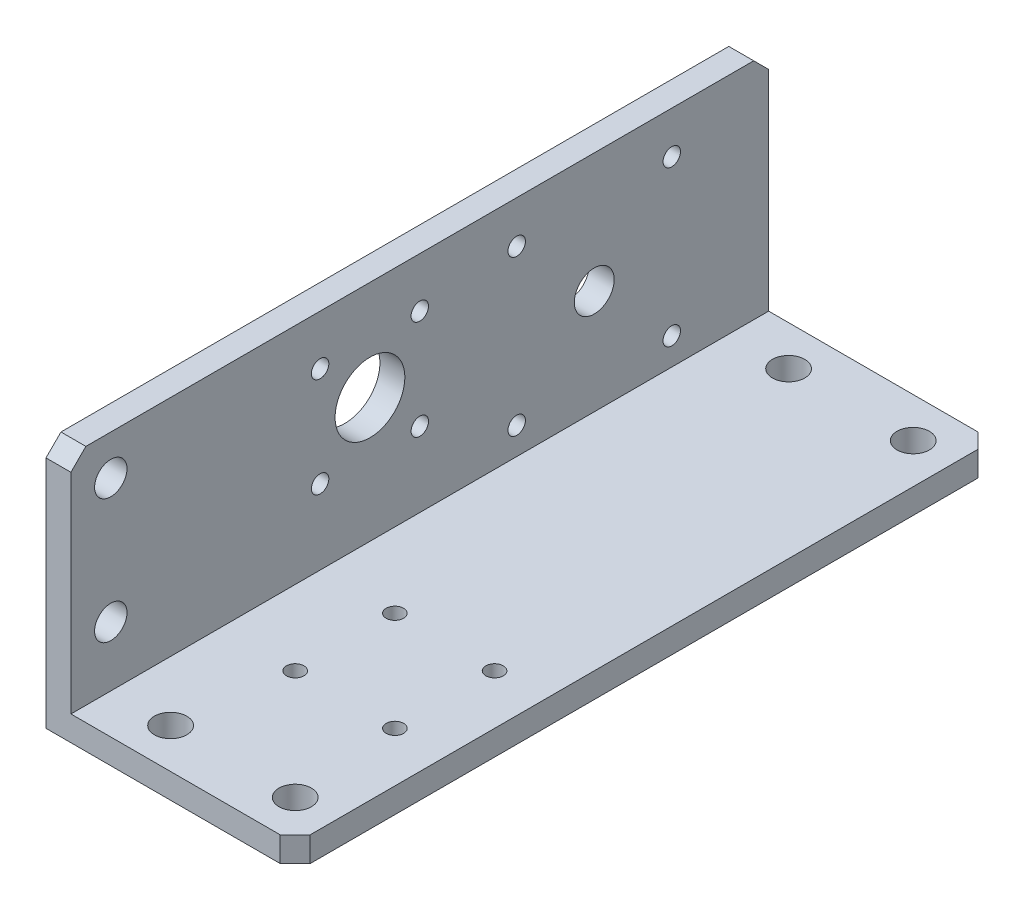
ISO-10303-21;
HEADER;
FILE_DESCRIPTION(('STEP AP214'),'2;1');
FILE_NAME('part.step','',(''),(''),'','','');
FILE_SCHEMA(('AUTOMOTIVE_DESIGN { 1 0 10303 214 1 1 1 1 }'));
ENDSEC;
DATA;
#1=APPLICATION_CONTEXT('core data for automotive mechanical design processes');
#2=APPLICATION_PROTOCOL_DEFINITION('international standard','automotive_design',2000,#1);
#3=PRODUCT_CONTEXT('',#1,'mechanical');
#4=PRODUCT('Part','Part','',(#3));
#5=PRODUCT_RELATED_PRODUCT_CATEGORY('part','',(#4));
#6=PRODUCT_DEFINITION_FORMATION('','',#4);
#7=PRODUCT_DEFINITION_CONTEXT('part definition',#1,'design');
#8=PRODUCT_DEFINITION('design','',#6,#7);
#9=PRODUCT_DEFINITION_SHAPE('','',#8);
#10=(LENGTH_UNIT() NAMED_UNIT(*) SI_UNIT(.MILLI.,.METRE.));
#11=(NAMED_UNIT(*) PLANE_ANGLE_UNIT() SI_UNIT($,.RADIAN.));
#12=(NAMED_UNIT(*) SI_UNIT($,.STERADIAN.) SOLID_ANGLE_UNIT());
#13=UNCERTAINTY_MEASURE_WITH_UNIT(LENGTH_MEASURE(1.E-05),#10,'distance_accuracy_value','');
#14=(GEOMETRIC_REPRESENTATION_CONTEXT(3) GLOBAL_UNCERTAINTY_ASSIGNED_CONTEXT((#13)) GLOBAL_UNIT_ASSIGNED_CONTEXT((#10,
#11,#12)) REPRESENTATION_CONTEXT('',''));
#15=CARTESIAN_POINT('',(0.,0.,0.));
#16=DIRECTION('',(0.,0.,1.));
#17=DIRECTION('',(1.,0.,0.));
#18=AXIS2_PLACEMENT_3D('',#15,#16,#17);
#19=CARTESIAN_POINT('',(50.,0.,140.));
#20=DIRECTION('',(0.,1.,0.));
#21=DIRECTION('',(-1.,0.,0.));
#22=AXIS2_PLACEMENT_3D('',#19,#20,#21);
#23=PLANE('',#22);
#24=CARTESIAN_POINT('',(40.0000000000001,0.,90.0000000000017));
#25=DIRECTION('',(0.,-1.,0.));
#26=DIRECTION('',(1.,0.,0.));
#27=AXIS2_PLACEMENT_3D('',#24,#25,#26);
#28=CIRCLE('',#27,1.74999999999955);
#29=CARTESIAN_POINT('',(41.7499999999996,0.,90.0000000000017));
#30=VERTEX_POINT('',#29);
#31=EDGE_CURVE('E287',#30,#30,#28,.T.);
#32=ORIENTED_EDGE('',*,*,#31,.F.);
#33=EDGE_LOOP('',(#32));
#34=FACE_BOUND('',#33,.T.);
#35=CARTESIAN_POINT('',(39.9999999999999,0.,110.000000000002));
#36=DIRECTION('',(0.,-1.,0.));
#37=DIRECTION('',(1.,0.,0.));
#38=AXIS2_PLACEMENT_3D('',#35,#36,#37);
#39=CIRCLE('',#38,1.74999999999956);
#40=CARTESIAN_POINT('',(41.7499999999995,0.,110.000000000002));
#41=VERTEX_POINT('',#40);
#42=EDGE_CURVE('E281',#41,#41,#39,.T.);
#43=ORIENTED_EDGE('',*,*,#42,.F.);
#44=EDGE_LOOP('',(#43));
#45=FACE_BOUND('',#44,.T.);
#46=CARTESIAN_POINT('',(19.9999999999999,0.,110.000000000002));
#47=DIRECTION('',(0.,-1.,0.));
#48=DIRECTION('',(1.,0.,0.));
#49=AXIS2_PLACEMENT_3D('',#46,#47,#48);
#50=CIRCLE('',#49,1.74999999999956);
#51=CARTESIAN_POINT('',(21.7499999999995,0.,110.000000000002));
#52=VERTEX_POINT('',#51);
#53=EDGE_CURVE('E275',#52,#52,#50,.T.);
#54=ORIENTED_EDGE('',*,*,#53,.F.);
#55=EDGE_LOOP('',(#54));
#56=FACE_BOUND('',#55,.T.);
#57=CARTESIAN_POINT('',(20.0000000000001,0.,90.0000000000015));
#58=DIRECTION('',(0.,-1.,0.));
#59=DIRECTION('',(1.,0.,0.));
#60=AXIS2_PLACEMENT_3D('',#57,#58,#59);
#61=CIRCLE('',#60,1.74999999999955);
#62=CARTESIAN_POINT('',(21.7499999999996,0.,90.0000000000015));
#63=VERTEX_POINT('',#62);
#64=EDGE_CURVE('E269',#63,#63,#61,.T.);
#65=ORIENTED_EDGE('',*,*,#64,.F.);
#66=EDGE_LOOP('',(#65));
#67=FACE_BOUND('',#66,.T.);
#68=CARTESIAN_POINT('',(17.,0.,8.00000000000001));
#69=DIRECTION('',(0.,-1.,0.));
#70=DIRECTION('',(0.,0.,-1.));
#71=AXIS2_PLACEMENT_3D('',#68,#69,#70);
#72=CIRCLE('',#71,3.24999999999999);
#73=CARTESIAN_POINT('',(17.,0.,4.75000000000002));
#74=VERTEX_POINT('',#73);
#75=EDGE_CURVE('E167',#74,#74,#72,.T.);
#76=ORIENTED_EDGE('',*,*,#75,.F.);
#77=EDGE_LOOP('',(#76));
#78=FACE_BOUND('',#77,.T.);
#79=CARTESIAN_POINT('',(42.,0.,8.00000000000001));
#80=DIRECTION('',(0.,-1.,0.));
#81=DIRECTION('',(0.,0.,-1.));
#82=AXIS2_PLACEMENT_3D('',#79,#80,#81);
#83=CIRCLE('',#82,3.24999999999999);
#84=CARTESIAN_POINT('',(42.,0.,4.75000000000002));
#85=VERTEX_POINT('',#84);
#86=EDGE_CURVE('E166',#85,#85,#83,.T.);
#87=ORIENTED_EDGE('',*,*,#86,.F.);
#88=EDGE_LOOP('',(#87));
#89=FACE_BOUND('',#88,.T.);
#90=CARTESIAN_POINT('',(17.,0.,132.));
#91=DIRECTION('',(0.,-1.,0.));
#92=DIRECTION('',(0.,0.,-1.));
#93=AXIS2_PLACEMENT_3D('',#90,#91,#92);
#94=CIRCLE('',#93,3.24999999999999);
#95=CARTESIAN_POINT('',(17.,0.,128.75));
#96=VERTEX_POINT('',#95);
#97=EDGE_CURVE('E214',#96,#96,#94,.T.);
#98=ORIENTED_EDGE('',*,*,#97,.F.);
#99=EDGE_LOOP('',(#98));
#100=FACE_BOUND('',#99,.T.);
#101=CARTESIAN_POINT('',(42.,0.,132.));
#102=DIRECTION('',(0.,-1.,0.));
#103=DIRECTION('',(0.,0.,-1.));
#104=AXIS2_PLACEMENT_3D('',#101,#102,#103);
#105=CIRCLE('',#104,3.24999999999999);
#106=CARTESIAN_POINT('',(42.,0.,128.75));
#107=VERTEX_POINT('',#106);
#108=EDGE_CURVE('E208',#107,#107,#105,.T.);
#109=ORIENTED_EDGE('',*,*,#108,.F.);
#110=EDGE_LOOP('',(#109));
#111=FACE_BOUND('',#110,.T.);
#112=DIRECTION('',(1.,0.,0.));
#113=VECTOR('',#112,1.);
#114=CARTESIAN_POINT('',(50.,0.,0.));
#115=LINE('',#114,#113);
#116=CARTESIAN_POINT('',(0.,0.,0.));
#117=VERTEX_POINT('',#116);
#118=CARTESIAN_POINT('',(47.,0.,0.));
#119=VERTEX_POINT('',#118);
#120=EDGE_CURVE('E142',#117,#119,#115,.T.);
#121=ORIENTED_EDGE('',*,*,#120,.T.);
#122=DIRECTION('',(0.707106781186552,0.,0.707106781186543));
#123=VECTOR('',#122,1.);
#124=CARTESIAN_POINT('',(50.,0.,3.));
#125=LINE('',#124,#123);
#126=CARTESIAN_POINT('',(50.,0.,3.00000000000004));
#127=VERTEX_POINT('',#126);
#128=EDGE_CURVE('E182',#119,#127,#125,.T.);
#129=ORIENTED_EDGE('',*,*,#128,.T.);
#130=DIRECTION('',(0.,0.,-1.));
#131=VECTOR('',#130,1.);
#132=CARTESIAN_POINT('',(50.,0.,140.));
#133=LINE('',#132,#131);
#134=CARTESIAN_POINT('',(50.,0.,137.));
#135=VERTEX_POINT('',#134);
#136=EDGE_CURVE('E159',#135,#127,#133,.T.);
#137=ORIENTED_EDGE('',*,*,#136,.F.);
#138=DIRECTION('',(0.707106781186548,0.,-0.707106781186548));
#139=VECTOR('',#138,1.);
#140=CARTESIAN_POINT('',(47.,0.,140.));
#141=LINE('',#140,#139);
#142=CARTESIAN_POINT('',(47.,0.,140.));
#143=VERTEX_POINT('',#142);
#144=EDGE_CURVE('E180',#135,#143,#141,.F.);
#145=ORIENTED_EDGE('',*,*,#144,.T.);
#146=DIRECTION('',(1.,0.,0.));
#147=VECTOR('',#146,1.);
#148=CARTESIAN_POINT('',(50.,0.,140.));
#149=LINE('',#148,#147);
#150=CARTESIAN_POINT('',(0.,0.,140.));
#151=VERTEX_POINT('',#150);
#152=EDGE_CURVE('E122',#151,#143,#149,.T.);
#153=ORIENTED_EDGE('',*,*,#152,.F.);
#154=DIRECTION('',(0.,0.,-1.));
#155=VECTOR('',#154,1.);
#156=CARTESIAN_POINT('',(0.,0.,140.));
#157=LINE('',#156,#155);
#158=EDGE_CURVE('E138',#151,#117,#157,.T.);
#159=ORIENTED_EDGE('',*,*,#158,.T.);
#160=EDGE_LOOP('',(#121,#129,#137,#145,#153,#159));
#161=FACE_BOUND('',#160,.T.);
#162=ADVANCED_FACE('F36',(#34,#45,#56,#67,#78,#89,#100,#111,#161),#23,.F.);
#163=CARTESIAN_POINT('',(50.,5.,140.));
#164=DIRECTION('',(-1.,0.,0.));
#165=DIRECTION('',(0.,0.,1.));
#166=AXIS2_PLACEMENT_3D('',#163,#164,#165);
#167=PLANE('',#166);
#168=ORIENTED_EDGE('',*,*,#136,.T.);
#169=DIRECTION('',(0.,1.,0.));
#170=VECTOR('',#169,1.);
#171=CARTESIAN_POINT('',(50.,5.,3.));
#172=LINE('',#171,#170);
#173=CARTESIAN_POINT('',(50.,5.,3.00000000000004));
#174=VERTEX_POINT('',#173);
#175=EDGE_CURVE('E169',#127,#174,#172,.T.);
#176=ORIENTED_EDGE('',*,*,#175,.T.);
#177=DIRECTION('',(0.,0.,-1.));
#178=VECTOR('',#177,1.);
#179=CARTESIAN_POINT('',(50.,5.,140.));
#180=LINE('',#179,#178);
#181=CARTESIAN_POINT('',(50.,5.,137.));
#182=VERTEX_POINT('',#181);
#183=EDGE_CURVE('E132',#182,#174,#180,.T.);
#184=ORIENTED_EDGE('',*,*,#183,.F.);
#185=DIRECTION('',(0.,-1.,0.));
#186=VECTOR('',#185,1.);
#187=CARTESIAN_POINT('',(50.,5.,137.));
#188=LINE('',#187,#186);
#189=EDGE_CURVE('E162',#182,#135,#188,.T.);
#190=ORIENTED_EDGE('',*,*,#189,.T.);
#191=EDGE_LOOP('',(#168,#176,#184,#190));
#192=FACE_BOUND('',#191,.T.);
#193=ADVANCED_FACE('F368',(#192),#167,.F.);
#194=CARTESIAN_POINT('',(5.00000000000001,5.,140.));
#195=DIRECTION('',(0.,-1.,0.));
#196=DIRECTION('',(1.,0.,0.));
#197=AXIS2_PLACEMENT_3D('',#194,#195,#196);
#198=PLANE('',#197);
#199=CARTESIAN_POINT('',(40.0000000000001,5.,90.0000000000017));
#200=DIRECTION('',(0.,-1.,0.));
#201=DIRECTION('',(1.,0.,0.));
#202=AXIS2_PLACEMENT_3D('',#199,#200,#201);
#203=CIRCLE('',#202,1.74999999999955);
#204=CARTESIAN_POINT('',(41.7499999999997,5.,90.0000000000017));
#205=VERTEX_POINT('',#204);
#206=EDGE_CURVE('E284',#205,#205,#203,.F.);
#207=ORIENTED_EDGE('',*,*,#206,.F.);
#208=EDGE_LOOP('',(#207));
#209=FACE_BOUND('',#208,.T.);
#210=CARTESIAN_POINT('',(39.9999999999999,5.,110.000000000002));
#211=DIRECTION('',(0.,-1.,0.));
#212=DIRECTION('',(1.,0.,0.));
#213=AXIS2_PLACEMENT_3D('',#210,#211,#212);
#214=CIRCLE('',#213,1.74999999999956);
#215=CARTESIAN_POINT('',(41.7499999999995,5.,110.000000000002));
#216=VERTEX_POINT('',#215);
#217=EDGE_CURVE('E278',#216,#216,#214,.F.);
#218=ORIENTED_EDGE('',*,*,#217,.F.);
#219=EDGE_LOOP('',(#218));
#220=FACE_BOUND('',#219,.T.);
#221=CARTESIAN_POINT('',(19.9999999999999,5.,110.000000000002));
#222=DIRECTION('',(0.,-1.,0.));
#223=DIRECTION('',(1.,0.,0.));
#224=AXIS2_PLACEMENT_3D('',#221,#222,#223);
#225=CIRCLE('',#224,1.74999999999956);
#226=CARTESIAN_POINT('',(21.7499999999995,5.,110.000000000002));
#227=VERTEX_POINT('',#226);
#228=EDGE_CURVE('E272',#227,#227,#225,.F.);
#229=ORIENTED_EDGE('',*,*,#228,.F.);
#230=EDGE_LOOP('',(#229));
#231=FACE_BOUND('',#230,.T.);
#232=CARTESIAN_POINT('',(20.0000000000001,5.,90.0000000000015));
#233=DIRECTION('',(0.,-1.,0.));
#234=DIRECTION('',(1.,0.,0.));
#235=AXIS2_PLACEMENT_3D('',#232,#233,#234);
#236=CIRCLE('',#235,1.74999999999955);
#237=CARTESIAN_POINT('',(21.7499999999996,5.,90.0000000000015));
#238=VERTEX_POINT('',#237);
#239=EDGE_CURVE('E266',#238,#238,#236,.F.);
#240=ORIENTED_EDGE('',*,*,#239,.F.);
#241=EDGE_LOOP('',(#240));
#242=FACE_BOUND('',#241,.T.);
#243=CARTESIAN_POINT('',(17.,5.,8.00000000000001));
#244=DIRECTION('',(0.,-1.,0.));
#245=DIRECTION('',(1.,0.,0.));
#246=AXIS2_PLACEMENT_3D('',#243,#244,#245);
#247=CIRCLE('',#246,3.24999999999999);
#248=CARTESIAN_POINT('',(20.25,5.,8.00000000000001));
#249=VERTEX_POINT('',#248);
#250=EDGE_CURVE('E163',#249,#249,#247,.T.);
#251=ORIENTED_EDGE('',*,*,#250,.T.);
#252=EDGE_LOOP('',(#251));
#253=FACE_BOUND('',#252,.T.);
#254=CARTESIAN_POINT('',(42.,5.,8.00000000000001));
#255=DIRECTION('',(0.,-1.,0.));
#256=DIRECTION('',(1.,0.,0.));
#257=AXIS2_PLACEMENT_3D('',#254,#255,#256);
#258=CIRCLE('',#257,3.24999999999999);
#259=CARTESIAN_POINT('',(45.25,5.,8.00000000000001));
#260=VERTEX_POINT('',#259);
#261=EDGE_CURVE('E229',#260,#260,#258,.T.);
#262=ORIENTED_EDGE('',*,*,#261,.T.);
#263=EDGE_LOOP('',(#262));
#264=FACE_BOUND('',#263,.T.);
#265=CARTESIAN_POINT('',(17.,5.,132.));
#266=DIRECTION('',(0.,-1.,0.));
#267=DIRECTION('',(1.,0.,0.));
#268=AXIS2_PLACEMENT_3D('',#265,#266,#267);
#269=CIRCLE('',#268,3.24999999999999);
#270=CARTESIAN_POINT('',(20.25,5.,132.));
#271=VERTEX_POINT('',#270);
#272=EDGE_CURVE('E211',#271,#271,#269,.T.);
#273=ORIENTED_EDGE('',*,*,#272,.T.);
#274=EDGE_LOOP('',(#273));
#275=FACE_BOUND('',#274,.T.);
#276=CARTESIAN_POINT('',(42.,5.,132.));
#277=DIRECTION('',(0.,-1.,0.));
#278=DIRECTION('',(1.,0.,0.));
#279=AXIS2_PLACEMENT_3D('',#276,#277,#278);
#280=CIRCLE('',#279,3.24999999999999);
#281=CARTESIAN_POINT('',(45.25,5.,132.));
#282=VERTEX_POINT('',#281);
#283=EDGE_CURVE('E145',#282,#282,#280,.T.);
#284=ORIENTED_EDGE('',*,*,#283,.T.);
#285=EDGE_LOOP('',(#284));
#286=FACE_BOUND('',#285,.T.);
#287=ORIENTED_EDGE('',*,*,#183,.T.);
#288=DIRECTION('',(-0.707106781186552,0.,-0.707106781186543));
#289=VECTOR('',#288,1.);
#290=CARTESIAN_POINT('',(50.,5.,3.));
#291=LINE('',#290,#289);
#292=CARTESIAN_POINT('',(46.9999999999999,5.,0.));
#293=VERTEX_POINT('',#292);
#294=EDGE_CURVE('E174',#174,#293,#291,.T.);
#295=ORIENTED_EDGE('',*,*,#294,.T.);
#296=DIRECTION('',(-1.,0.,0.));
#297=VECTOR('',#296,1.);
#298=CARTESIAN_POINT('',(5.00000000000001,5.,0.));
#299=LINE('',#298,#297);
#300=CARTESIAN_POINT('',(5.00000000000001,5.,0.));
#301=VERTEX_POINT('',#300);
#302=EDGE_CURVE('E129',#293,#301,#299,.T.);
#303=ORIENTED_EDGE('',*,*,#302,.T.);
#304=DIRECTION('',(0.,0.,-1.));
#305=VECTOR('',#304,1.);
#306=CARTESIAN_POINT('',(5.00000000000001,5.,140.));
#307=LINE('',#306,#305);
#308=CARTESIAN_POINT('',(5.00000000000001,5.,140.));
#309=VERTEX_POINT('',#308);
#310=EDGE_CURVE('E125',#309,#301,#307,.T.);
#311=ORIENTED_EDGE('',*,*,#310,.F.);
#312=DIRECTION('',(-1.,0.,0.));
#313=VECTOR('',#312,1.);
#314=CARTESIAN_POINT('',(5.00000000000001,5.,140.));
#315=LINE('',#314,#313);
#316=CARTESIAN_POINT('',(47.,5.,140.));
#317=VERTEX_POINT('',#316);
#318=EDGE_CURVE('E115',#317,#309,#315,.T.);
#319=ORIENTED_EDGE('',*,*,#318,.F.);
#320=DIRECTION('',(-0.707106781186548,0.,0.707106781186548));
#321=VECTOR('',#320,1.);
#322=CARTESIAN_POINT('',(47.,5.,140.));
#323=LINE('',#322,#321);
#324=EDGE_CURVE('E172',#317,#182,#323,.F.);
#325=ORIENTED_EDGE('',*,*,#324,.T.);
#326=EDGE_LOOP('',(#287,#295,#303,#311,#319,#325));
#327=FACE_BOUND('',#326,.T.);
#328=ADVANCED_FACE('F127',(#209,#220,#231,#242,#253,#264,#275,#286,#327),#198,.F.);
#329=CARTESIAN_POINT('',(5.,50.,140.));
#330=DIRECTION('',(-1.,0.,0.));
#331=DIRECTION('',(0.,-1.,0.));
#332=AXIS2_PLACEMENT_3D('',#329,#330,#331);
#333=PLANE('',#332);
#334=CARTESIAN_POINT('',(5.,41.556349186104,19.4436508138959));
#335=DIRECTION('',(-1.,0.,0.));
#336=DIRECTION('',(0.,-1.,0.));
#337=AXIS2_PLACEMENT_3D('',#334,#335,#336);
#338=CIRCLE('',#337,1.75);
#339=CARTESIAN_POINT('',(5.,39.806349186104,19.4436508138959));
#340=VERTEX_POINT('',#339);
#341=EDGE_CURVE('E314',#340,#340,#338,.F.);
#342=ORIENTED_EDGE('',*,*,#341,.F.);
#343=EDGE_LOOP('',(#342));
#344=FACE_BOUND('',#343,.T.);
#345=CARTESIAN_POINT('',(5.,10.4436508138959,19.443650813896));
#346=DIRECTION('',(-1.,0.,0.));
#347=DIRECTION('',(0.,-1.,0.));
#348=AXIS2_PLACEMENT_3D('',#345,#346,#347);
#349=CIRCLE('',#348,1.75);
#350=CARTESIAN_POINT('',(5.,8.69365081389592,19.443650813896));
#351=VERTEX_POINT('',#350);
#352=EDGE_CURVE('E308',#351,#351,#349,.F.);
#353=ORIENTED_EDGE('',*,*,#352,.F.);
#354=EDGE_LOOP('',(#353));
#355=FACE_BOUND('',#354,.T.);
#356=CARTESIAN_POINT('',(5.,10.443650813896,50.5563491861041));
#357=DIRECTION('',(-1.,0.,0.));
#358=DIRECTION('',(0.,-1.,0.));
#359=AXIS2_PLACEMENT_3D('',#356,#357,#358);
#360=CIRCLE('',#359,1.75);
#361=CARTESIAN_POINT('',(5.,8.69365081389599,50.5563491861041));
#362=VERTEX_POINT('',#361);
#363=EDGE_CURVE('E302',#362,#362,#360,.F.);
#364=ORIENTED_EDGE('',*,*,#363,.F.);
#365=EDGE_LOOP('',(#364));
#366=FACE_BOUND('',#365,.T.);
#367=CARTESIAN_POINT('',(5.,26.,35.));
#368=DIRECTION('',(-1.,0.,0.));
#369=DIRECTION('',(0.,-1.,0.));
#370=AXIS2_PLACEMENT_3D('',#367,#368,#369);
#371=CIRCLE('',#370,4.);
#372=CARTESIAN_POINT('',(5.00000000000001,22.,35.));
#373=VERTEX_POINT('',#372);
#374=EDGE_CURVE('E296',#373,#373,#371,.F.);
#375=ORIENTED_EDGE('',*,*,#374,.F.);
#376=EDGE_LOOP('',(#375));
#377=FACE_BOUND('',#376,.T.);
#378=CARTESIAN_POINT('',(5.,41.5563491861041,50.556349186104));
#379=DIRECTION('',(-1.,0.,0.));
#380=DIRECTION('',(0.,-1.,0.));
#381=AXIS2_PLACEMENT_3D('',#378,#379,#380);
#382=CIRCLE('',#381,1.75);
#383=CARTESIAN_POINT('',(5.,39.8063491861041,50.556349186104));
#384=VERTEX_POINT('',#383);
#385=EDGE_CURVE('E290',#384,#384,#382,.F.);
#386=ORIENTED_EDGE('',*,*,#385,.F.);
#387=EDGE_LOOP('',(#386));
#388=FACE_BOUND('',#387,.T.);
#389=CARTESIAN_POINT('',(5.,20.,70.));
#390=DIRECTION('',(-1.,0.,0.));
#391=DIRECTION('',(0.,-1.,0.));
#392=AXIS2_PLACEMENT_3D('',#389,#390,#391);
#393=CIRCLE('',#392,1.75);
#394=CARTESIAN_POINT('',(5.,18.25,70.));
#395=VERTEX_POINT('',#394);
#396=EDGE_CURVE('E260',#395,#395,#393,.F.);
#397=ORIENTED_EDGE('',*,*,#396,.F.);
#398=EDGE_LOOP('',(#397));
#399=FACE_BOUND('',#398,.T.);
#400=CARTESIAN_POINT('',(5.,20.,90.));
#401=DIRECTION('',(-1.,0.,0.));
#402=DIRECTION('',(0.,-1.,0.));
#403=AXIS2_PLACEMENT_3D('',#400,#401,#402);
#404=CIRCLE('',#403,1.75);
#405=CARTESIAN_POINT('',(5.,18.25,90.));
#406=VERTEX_POINT('',#405);
#407=EDGE_CURVE('E254',#406,#406,#404,.F.);
#408=ORIENTED_EDGE('',*,*,#407,.F.);
#409=EDGE_LOOP('',(#408));
#410=FACE_BOUND('',#409,.T.);
#411=CARTESIAN_POINT('',(5.,40.,90.));
#412=DIRECTION('',(-1.,0.,0.));
#413=DIRECTION('',(0.,-1.,0.));
#414=AXIS2_PLACEMENT_3D('',#411,#412,#413);
#415=CIRCLE('',#414,1.75);
#416=CARTESIAN_POINT('',(5.,38.25,90.));
#417=VERTEX_POINT('',#416);
#418=EDGE_CURVE('E248',#417,#417,#415,.F.);
#419=ORIENTED_EDGE('',*,*,#418,.F.);
#420=EDGE_LOOP('',(#419));
#421=FACE_BOUND('',#420,.T.);
#422=CARTESIAN_POINT('',(5.,30.,80.));
#423=DIRECTION('',(-1.,0.,0.));
#424=DIRECTION('',(0.,-1.,0.));
#425=AXIS2_PLACEMENT_3D('',#422,#423,#424);
#426=CIRCLE('',#425,7.);
#427=CARTESIAN_POINT('',(5.00000000000001,23.,80.));
#428=VERTEX_POINT('',#427);
#429=EDGE_CURVE('E242',#428,#428,#426,.F.);
#430=ORIENTED_EDGE('',*,*,#429,.F.);
#431=EDGE_LOOP('',(#430));
#432=FACE_BOUND('',#431,.T.);
#433=CARTESIAN_POINT('',(5.,40.,70.));
#434=DIRECTION('',(-1.,0.,0.));
#435=DIRECTION('',(0.,-1.,0.));
#436=AXIS2_PLACEMENT_3D('',#433,#434,#435);
#437=CIRCLE('',#436,1.75);
#438=CARTESIAN_POINT('',(5.,38.25,70.));
#439=VERTEX_POINT('',#438);
#440=EDGE_CURVE('E236',#439,#439,#437,.F.);
#441=ORIENTED_EDGE('',*,*,#440,.F.);
#442=EDGE_LOOP('',(#441));
#443=FACE_BOUND('',#442,.T.);
#444=CARTESIAN_POINT('',(5.,42.,132.));
#445=DIRECTION('',(-1.,0.,0.));
#446=DIRECTION('',(0.,0.,1.));
#447=AXIS2_PLACEMENT_3D('',#444,#445,#446);
#448=CIRCLE('',#447,3.25);
#449=CARTESIAN_POINT('',(5.,42.,135.25));
#450=VERTEX_POINT('',#449);
#451=EDGE_CURVE('E223',#450,#450,#448,.T.);
#452=ORIENTED_EDGE('',*,*,#451,.T.);
#453=EDGE_LOOP('',(#452));
#454=FACE_BOUND('',#453,.T.);
#455=CARTESIAN_POINT('',(5.,17.,132.));
#456=DIRECTION('',(-1.,0.,0.));
#457=DIRECTION('',(0.,0.,1.));
#458=AXIS2_PLACEMENT_3D('',#455,#456,#457);
#459=CIRCLE('',#458,3.25);
#460=CARTESIAN_POINT('',(5.,17.,135.25));
#461=VERTEX_POINT('',#460);
#462=EDGE_CURVE('E217',#461,#461,#459,.T.);
#463=ORIENTED_EDGE('',*,*,#462,.T.);
#464=EDGE_LOOP('',(#463));
#465=FACE_BOUND('',#464,.T.);
#466=DIRECTION('',(0.,1.,0.));
#467=VECTOR('',#466,1.);
#468=CARTESIAN_POINT('',(5.,50.,0.));
#469=LINE('',#468,#467);
#470=CARTESIAN_POINT('',(5.,47.,0.));
#471=VERTEX_POINT('',#470);
#472=EDGE_CURVE('E147',#301,#471,#469,.T.);
#473=ORIENTED_EDGE('',*,*,#472,.T.);
#474=DIRECTION('',(0.,0.707106781186552,0.707106781186543));
#475=VECTOR('',#474,1.);
#476=CARTESIAN_POINT('',(5.,50.,3.));
#477=LINE('',#476,#475);
#478=CARTESIAN_POINT('',(5.,50.,3.00000000000004));
#479=VERTEX_POINT('',#478);
#480=EDGE_CURVE('E193',#471,#479,#477,.T.);
#481=ORIENTED_EDGE('',*,*,#480,.T.);
#482=DIRECTION('',(0.,0.,-1.));
#483=VECTOR('',#482,1.);
#484=CARTESIAN_POINT('',(5.,50.,140.));
#485=LINE('',#484,#483);
#486=CARTESIAN_POINT('',(5.,50.,137.));
#487=VERTEX_POINT('',#486);
#488=EDGE_CURVE('E133',#487,#479,#485,.T.);
#489=ORIENTED_EDGE('',*,*,#488,.F.);
#490=DIRECTION('',(0.,0.707106781186548,-0.707106781186548));
#491=VECTOR('',#490,1.);
#492=CARTESIAN_POINT('',(5.,47.,140.));
#493=LINE('',#492,#491);
#494=CARTESIAN_POINT('',(5.,47.,140.));
#495=VERTEX_POINT('',#494);
#496=EDGE_CURVE('E51',#487,#495,#493,.F.);
#497=ORIENTED_EDGE('',*,*,#496,.T.);
#498=DIRECTION('',(0.,1.,0.));
#499=VECTOR('',#498,1.);
#500=CARTESIAN_POINT('',(5.,50.,140.));
#501=LINE('',#500,#499);
#502=EDGE_CURVE('E119',#309,#495,#501,.T.);
#503=ORIENTED_EDGE('',*,*,#502,.F.);
#504=ORIENTED_EDGE('',*,*,#310,.T.);
#505=EDGE_LOOP('',(#473,#481,#489,#497,#503,#504));
#506=FACE_BOUND('',#505,.T.);
#507=ADVANCED_FACE('F135',(#344,#355,#366,#377,#388,#399,#410,#421,#432,#443,#454,#465,#506),
#333,.F.);
#508=CARTESIAN_POINT('',(0.,50.,140.));
#509=DIRECTION('',(0.,-1.,0.));
#510=DIRECTION('',(0.,0.,-1.));
#511=AXIS2_PLACEMENT_3D('',#508,#509,#510);
#512=PLANE('',#511);
#513=ORIENTED_EDGE('',*,*,#488,.T.);
#514=DIRECTION('',(-1.,0.,0.));
#515=VECTOR('',#514,1.);
#516=CARTESIAN_POINT('',(0.,50.,3.));
#517=LINE('',#516,#515);
#518=CARTESIAN_POINT('',(0.,50.,3.00000000000004));
#519=VERTEX_POINT('',#518);
#520=EDGE_CURVE('E186',#479,#519,#517,.T.);
#521=ORIENTED_EDGE('',*,*,#520,.T.);
#522=DIRECTION('',(0.,0.,-1.));
#523=VECTOR('',#522,1.);
#524=CARTESIAN_POINT('',(0.,50.,140.));
#525=LINE('',#524,#523);
#526=CARTESIAN_POINT('',(0.,50.,137.));
#527=VERTEX_POINT('',#526);
#528=EDGE_CURVE('E153',#527,#519,#525,.T.);
#529=ORIENTED_EDGE('',*,*,#528,.F.);
#530=DIRECTION('',(1.,0.,0.));
#531=VECTOR('',#530,1.);
#532=CARTESIAN_POINT('',(0.,50.,137.));
#533=LINE('',#532,#531);
#534=EDGE_CURVE('E184',#527,#487,#533,.T.);
#535=ORIENTED_EDGE('',*,*,#534,.T.);
#536=EDGE_LOOP('',(#513,#521,#529,#535));
#537=FACE_BOUND('',#536,.T.);
#538=ADVANCED_FACE('F326',(#537),#512,.F.);
#539=CARTESIAN_POINT('',(0.,0.,140.));
#540=DIRECTION('',(1.,0.,0.));
#541=DIRECTION('',(0.,0.,-1.));
#542=AXIS2_PLACEMENT_3D('',#539,#540,#541);
#543=PLANE('',#542);
#544=CARTESIAN_POINT('',(0.,41.556349186104,19.4436508138959));
#545=DIRECTION('',(-1.,0.,0.));
#546=DIRECTION('',(0.,0.,1.));
#547=AXIS2_PLACEMENT_3D('',#544,#545,#546);
#548=CIRCLE('',#547,1.75);
#549=CARTESIAN_POINT('',(0.,41.556349186104,21.1936508138959));
#550=VERTEX_POINT('',#549);
#551=EDGE_CURVE('E317',#550,#550,#548,.T.);
#552=ORIENTED_EDGE('',*,*,#551,.F.);
#553=EDGE_LOOP('',(#552));
#554=FACE_BOUND('',#553,.T.);
#555=CARTESIAN_POINT('',(0.,10.4436508138959,19.443650813896));
#556=DIRECTION('',(-1.,0.,0.));
#557=DIRECTION('',(0.,0.,1.));
#558=AXIS2_PLACEMENT_3D('',#555,#556,#557);
#559=CIRCLE('',#558,1.75);
#560=CARTESIAN_POINT('',(0.,10.4436508138959,21.193650813896));
#561=VERTEX_POINT('',#560);
#562=EDGE_CURVE('E311',#561,#561,#559,.T.);
#563=ORIENTED_EDGE('',*,*,#562,.F.);
#564=EDGE_LOOP('',(#563));
#565=FACE_BOUND('',#564,.T.);
#566=CARTESIAN_POINT('',(0.,10.443650813896,50.5563491861041));
#567=DIRECTION('',(-1.,0.,0.));
#568=DIRECTION('',(0.,0.,1.));
#569=AXIS2_PLACEMENT_3D('',#566,#567,#568);
#570=CIRCLE('',#569,1.75);
#571=CARTESIAN_POINT('',(0.,10.443650813896,52.3063491861041));
#572=VERTEX_POINT('',#571);
#573=EDGE_CURVE('E305',#572,#572,#570,.T.);
#574=ORIENTED_EDGE('',*,*,#573,.F.);
#575=EDGE_LOOP('',(#574));
#576=FACE_BOUND('',#575,.T.);
#577=CARTESIAN_POINT('',(0.,26.,35.));
#578=DIRECTION('',(-1.,0.,0.));
#579=DIRECTION('',(0.,0.,1.));
#580=AXIS2_PLACEMENT_3D('',#577,#578,#579);
#581=CIRCLE('',#580,4.);
#582=CARTESIAN_POINT('',(0.,26.,39.));
#583=VERTEX_POINT('',#582);
#584=EDGE_CURVE('E299',#583,#583,#581,.T.);
#585=ORIENTED_EDGE('',*,*,#584,.F.);
#586=EDGE_LOOP('',(#585));
#587=FACE_BOUND('',#586,.T.);
#588=CARTESIAN_POINT('',(0.,41.5563491861041,50.556349186104));
#589=DIRECTION('',(-1.,0.,0.));
#590=DIRECTION('',(0.,0.,1.));
#591=AXIS2_PLACEMENT_3D('',#588,#589,#590);
#592=CIRCLE('',#591,1.75);
#593=CARTESIAN_POINT('',(0.,41.5563491861041,52.306349186104));
#594=VERTEX_POINT('',#593);
#595=EDGE_CURVE('E293',#594,#594,#592,.T.);
#596=ORIENTED_EDGE('',*,*,#595,.F.);
#597=EDGE_LOOP('',(#596));
#598=FACE_BOUND('',#597,.T.);
#599=CARTESIAN_POINT('',(0.,20.,70.));
#600=DIRECTION('',(-1.,0.,0.));
#601=DIRECTION('',(0.,0.,1.));
#602=AXIS2_PLACEMENT_3D('',#599,#600,#601);
#603=CIRCLE('',#602,1.75);
#604=CARTESIAN_POINT('',(0.,20.,71.75));
#605=VERTEX_POINT('',#604);
#606=EDGE_CURVE('E263',#605,#605,#603,.T.);
#607=ORIENTED_EDGE('',*,*,#606,.F.);
#608=EDGE_LOOP('',(#607));
#609=FACE_BOUND('',#608,.T.);
#610=CARTESIAN_POINT('',(0.,20.,90.));
#611=DIRECTION('',(-1.,0.,0.));
#612=DIRECTION('',(0.,0.,1.));
#613=AXIS2_PLACEMENT_3D('',#610,#611,#612);
#614=CIRCLE('',#613,1.75);
#615=CARTESIAN_POINT('',(0.,20.,91.75));
#616=VERTEX_POINT('',#615);
#617=EDGE_CURVE('E257',#616,#616,#614,.T.);
#618=ORIENTED_EDGE('',*,*,#617,.F.);
#619=EDGE_LOOP('',(#618));
#620=FACE_BOUND('',#619,.T.);
#621=CARTESIAN_POINT('',(0.,40.,90.));
#622=DIRECTION('',(-1.,0.,0.));
#623=DIRECTION('',(0.,0.,1.));
#624=AXIS2_PLACEMENT_3D('',#621,#622,#623);
#625=CIRCLE('',#624,1.75);
#626=CARTESIAN_POINT('',(0.,40.,91.75));
#627=VERTEX_POINT('',#626);
#628=EDGE_CURVE('E251',#627,#627,#625,.T.);
#629=ORIENTED_EDGE('',*,*,#628,.F.);
#630=EDGE_LOOP('',(#629));
#631=FACE_BOUND('',#630,.T.);
#632=CARTESIAN_POINT('',(0.,30.,80.));
#633=DIRECTION('',(-1.,0.,0.));
#634=DIRECTION('',(0.,0.,1.));
#635=AXIS2_PLACEMENT_3D('',#632,#633,#634);
#636=CIRCLE('',#635,7.);
#637=CARTESIAN_POINT('',(0.,30.,87.));
#638=VERTEX_POINT('',#637);
#639=EDGE_CURVE('E245',#638,#638,#636,.T.);
#640=ORIENTED_EDGE('',*,*,#639,.F.);
#641=EDGE_LOOP('',(#640));
#642=FACE_BOUND('',#641,.T.);
#643=CARTESIAN_POINT('',(0.,40.,70.));
#644=DIRECTION('',(-1.,0.,0.));
#645=DIRECTION('',(0.,0.,1.));
#646=AXIS2_PLACEMENT_3D('',#643,#644,#645);
#647=CIRCLE('',#646,1.75);
#648=CARTESIAN_POINT('',(0.,40.,71.75));
#649=VERTEX_POINT('',#648);
#650=EDGE_CURVE('E239',#649,#649,#647,.T.);
#651=ORIENTED_EDGE('',*,*,#650,.F.);
#652=EDGE_LOOP('',(#651));
#653=FACE_BOUND('',#652,.T.);
#654=CARTESIAN_POINT('',(0.,42.,132.));
#655=DIRECTION('',(-1.,0.,0.));
#656=DIRECTION('',(0.,0.,1.));
#657=AXIS2_PLACEMENT_3D('',#654,#655,#656);
#658=CIRCLE('',#657,3.24999999999999);
#659=CARTESIAN_POINT('',(0.,42.,135.25));
#660=VERTEX_POINT('',#659);
#661=EDGE_CURVE('E226',#660,#660,#658,.T.);
#662=ORIENTED_EDGE('',*,*,#661,.F.);
#663=EDGE_LOOP('',(#662));
#664=FACE_BOUND('',#663,.T.);
#665=CARTESIAN_POINT('',(0.,17.,132.));
#666=DIRECTION('',(-1.,0.,0.));
#667=DIRECTION('',(0.,0.,1.));
#668=AXIS2_PLACEMENT_3D('',#665,#666,#667);
#669=CIRCLE('',#668,3.24999999999999);
#670=CARTESIAN_POINT('',(0.,17.,135.25));
#671=VERTEX_POINT('',#670);
#672=EDGE_CURVE('E220',#671,#671,#669,.T.);
#673=ORIENTED_EDGE('',*,*,#672,.F.);
#674=EDGE_LOOP('',(#673));
#675=FACE_BOUND('',#674,.T.);
#676=ORIENTED_EDGE('',*,*,#528,.T.);
#677=DIRECTION('',(0.,-0.707106781186552,-0.707106781186543));
#678=VECTOR('',#677,1.);
#679=CARTESIAN_POINT('',(0.,50.,3.));
#680=LINE('',#679,#678);
#681=CARTESIAN_POINT('',(0.,47.,0.));
#682=VERTEX_POINT('',#681);
#683=EDGE_CURVE('E190',#519,#682,#680,.T.);
#684=ORIENTED_EDGE('',*,*,#683,.T.);
#685=DIRECTION('',(0.,-1.,0.));
#686=VECTOR('',#685,1.);
#687=CARTESIAN_POINT('',(0.,0.,0.));
#688=LINE('',#687,#686);
#689=EDGE_CURVE('E149',#682,#117,#688,.T.);
#690=ORIENTED_EDGE('',*,*,#689,.T.);
#691=ORIENTED_EDGE('',*,*,#158,.F.);
#692=DIRECTION('',(0.,-1.,0.));
#693=VECTOR('',#692,1.);
#694=CARTESIAN_POINT('',(0.,0.,140.));
#695=LINE('',#694,#693);
#696=CARTESIAN_POINT('',(0.,47.,140.));
#697=VERTEX_POINT('',#696);
#698=EDGE_CURVE('E136',#697,#151,#695,.T.);
#699=ORIENTED_EDGE('',*,*,#698,.F.);
#700=DIRECTION('',(0.,-0.707106781186548,0.707106781186548));
#701=VECTOR('',#700,1.);
#702=CARTESIAN_POINT('',(0.,47.,140.));
#703=LINE('',#702,#701);
#704=EDGE_CURVE('E59',#697,#527,#703,.F.);
#705=ORIENTED_EDGE('',*,*,#704,.T.);
#706=EDGE_LOOP('',(#676,#684,#690,#691,#699,#705));
#707=FACE_BOUND('',#706,.T.);
#708=ADVANCED_FACE('F197',(#554,#565,#576,#587,#598,#609,#620,#631,#642,#653,#664,#675,#707),
#543,.F.);
#709=CARTESIAN_POINT('',(0.,0.,140.));
#710=DIRECTION('',(0.,0.,-1.));
#711=DIRECTION('',(-1.,0.,0.));
#712=AXIS2_PLACEMENT_3D('',#709,#710,#711);
#713=PLANE('',#712);
#714=ORIENTED_EDGE('',*,*,#152,.T.);
#715=DIRECTION('',(0.,1.,0.));
#716=VECTOR('',#715,1.);
#717=CARTESIAN_POINT('',(47.,0.,140.));
#718=LINE('',#717,#716);
#719=EDGE_CURVE('E11',#143,#317,#718,.T.);
#720=ORIENTED_EDGE('',*,*,#719,.T.);
#721=ORIENTED_EDGE('',*,*,#318,.T.);
#722=ORIENTED_EDGE('',*,*,#502,.T.);
#723=DIRECTION('',(-1.,0.,0.));
#724=VECTOR('',#723,1.);
#725=CARTESIAN_POINT('',(0.,47.,140.));
#726=LINE('',#725,#724);
#727=EDGE_CURVE('E44',#495,#697,#726,.T.);
#728=ORIENTED_EDGE('',*,*,#727,.T.);
#729=ORIENTED_EDGE('',*,*,#698,.T.);
#730=EDGE_LOOP('',(#714,#720,#721,#722,#728,#729));
#731=FACE_BOUND('',#730,.T.);
#732=ADVANCED_FACE('F118',(#731),#713,.F.);
#733=CARTESIAN_POINT('',(0.,0.,0.));
#734=DIRECTION('',(0.,0.,-1.));
#735=DIRECTION('',(-1.,0.,0.));
#736=AXIS2_PLACEMENT_3D('',#733,#734,#735);
#737=PLANE('',#736);
#738=ORIENTED_EDGE('',*,*,#302,.F.);
#739=DIRECTION('',(0.,-1.,0.));
#740=VECTOR('',#739,1.);
#741=CARTESIAN_POINT('',(47.,0.,0.));
#742=LINE('',#741,#740);
#743=EDGE_CURVE('E178',#293,#119,#742,.T.);
#744=ORIENTED_EDGE('',*,*,#743,.T.);
#745=ORIENTED_EDGE('',*,*,#120,.F.);
#746=ORIENTED_EDGE('',*,*,#689,.F.);
#747=DIRECTION('',(1.,0.,0.));
#748=VECTOR('',#747,1.);
#749=CARTESIAN_POINT('',(5.,47.,0.));
#750=LINE('',#749,#748);
#751=EDGE_CURVE('E176',#682,#471,#750,.T.);
#752=ORIENTED_EDGE('',*,*,#751,.T.);
#753=ORIENTED_EDGE('',*,*,#472,.F.);
#754=EDGE_LOOP('',(#738,#744,#745,#746,#752,#753));
#755=FACE_BOUND('',#754,.T.);
#756=ADVANCED_FACE('F399',(#755),#737,.T.);
#757=CARTESIAN_POINT('',(42.,0.,132.));
#758=DIRECTION('',(0.,-1.,0.));
#759=DIRECTION('',(0.,0.,-1.));
#760=AXIS2_PLACEMENT_3D('',#757,#758,#759);
#761=CYLINDRICAL_SURFACE('',#760,3.24999999999999);
#762=ORIENTED_EDGE('',*,*,#108,.T.);
#763=EDGE_LOOP('',(#762));
#764=FACE_BOUND('',#763,.T.);
#765=ORIENTED_EDGE('',*,*,#283,.F.);
#766=EDGE_LOOP('',(#765));
#767=FACE_BOUND('',#766,.T.);
#768=ADVANCED_FACE('F363',(#764,#767),#761,.F.);
#769=CARTESIAN_POINT('',(17.,0.,132.));
#770=DIRECTION('',(0.,-1.,0.));
#771=DIRECTION('',(0.,0.,-1.));
#772=AXIS2_PLACEMENT_3D('',#769,#770,#771);
#773=CYLINDRICAL_SURFACE('',#772,3.24999999999999);
#774=ORIENTED_EDGE('',*,*,#97,.T.);
#775=EDGE_LOOP('',(#774));
#776=FACE_BOUND('',#775,.T.);
#777=ORIENTED_EDGE('',*,*,#272,.F.);
#778=EDGE_LOOP('',(#777));
#779=FACE_BOUND('',#778,.T.);
#780=ADVANCED_FACE('F353',(#776,#779),#773,.F.);
#781=CARTESIAN_POINT('',(0.,17.,132.));
#782=DIRECTION('',(-1.,0.,0.));
#783=DIRECTION('',(0.,0.,1.));
#784=AXIS2_PLACEMENT_3D('',#781,#782,#783);
#785=CYLINDRICAL_SURFACE('',#784,3.24999999999999);
#786=ORIENTED_EDGE('',*,*,#462,.F.);
#787=EDGE_LOOP('',(#786));
#788=FACE_BOUND('',#787,.T.);
#789=ORIENTED_EDGE('',*,*,#672,.T.);
#790=EDGE_LOOP('',(#789));
#791=FACE_BOUND('',#790,.T.);
#792=ADVANCED_FACE('F350',(#788,#791),#785,.F.);
#793=CARTESIAN_POINT('',(0.,42.,132.));
#794=DIRECTION('',(-1.,0.,0.));
#795=DIRECTION('',(0.,0.,1.));
#796=AXIS2_PLACEMENT_3D('',#793,#794,#795);
#797=CYLINDRICAL_SURFACE('',#796,3.24999999999999);
#798=ORIENTED_EDGE('',*,*,#451,.F.);
#799=EDGE_LOOP('',(#798));
#800=FACE_BOUND('',#799,.T.);
#801=ORIENTED_EDGE('',*,*,#661,.T.);
#802=EDGE_LOOP('',(#801));
#803=FACE_BOUND('',#802,.T.);
#804=ADVANCED_FACE('F352',(#800,#803),#797,.F.);
#805=CARTESIAN_POINT('',(42.,0.,8.00000000000001));
#806=DIRECTION('',(0.,-1.,0.));
#807=DIRECTION('',(0.,0.,-1.));
#808=AXIS2_PLACEMENT_3D('',#805,#806,#807);
#809=CYLINDRICAL_SURFACE('',#808,3.24999999999999);
#810=ORIENTED_EDGE('',*,*,#86,.T.);
#811=EDGE_LOOP('',(#810));
#812=FACE_BOUND('',#811,.T.);
#813=ORIENTED_EDGE('',*,*,#261,.F.);
#814=EDGE_LOOP('',(#813));
#815=FACE_BOUND('',#814,.T.);
#816=ADVANCED_FACE('F360',(#812,#815),#809,.F.);
#817=CARTESIAN_POINT('',(17.,0.,8.00000000000001));
#818=DIRECTION('',(0.,-1.,0.));
#819=DIRECTION('',(0.,0.,-1.));
#820=AXIS2_PLACEMENT_3D('',#817,#818,#819);
#821=CYLINDRICAL_SURFACE('',#820,3.24999999999999);
#822=ORIENTED_EDGE('',*,*,#75,.T.);
#823=EDGE_LOOP('',(#822));
#824=FACE_BOUND('',#823,.T.);
#825=ORIENTED_EDGE('',*,*,#250,.F.);
#826=EDGE_LOOP('',(#825));
#827=FACE_BOUND('',#826,.T.);
#828=ADVANCED_FACE('F582',(#824,#827),#821,.F.);
#829=CARTESIAN_POINT('',(50.001,40.,70.));
#830=DIRECTION('',(-1.,0.,0.));
#831=DIRECTION('',(0.,0.,1.));
#832=AXIS2_PLACEMENT_3D('',#829,#830,#831);
#833=CYLINDRICAL_SURFACE('',#832,1.75);
#834=ORIENTED_EDGE('',*,*,#650,.T.);
#835=EDGE_LOOP('',(#834));
#836=FACE_BOUND('',#835,.T.);
#837=ORIENTED_EDGE('',*,*,#440,.T.);
#838=EDGE_LOOP('',(#837));
#839=FACE_BOUND('',#838,.T.);
#840=ADVANCED_FACE('F574',(#836,#839),#833,.F.);
#841=CARTESIAN_POINT('',(50.001,30.,80.));
#842=DIRECTION('',(-1.,0.,0.));
#843=DIRECTION('',(0.,0.,1.));
#844=AXIS2_PLACEMENT_3D('',#841,#842,#843);
#845=CYLINDRICAL_SURFACE('',#844,7.);
#846=ORIENTED_EDGE('',*,*,#639,.T.);
#847=EDGE_LOOP('',(#846));
#848=FACE_BOUND('',#847,.T.);
#849=ORIENTED_EDGE('',*,*,#429,.T.);
#850=EDGE_LOOP('',(#849));
#851=FACE_BOUND('',#850,.T.);
#852=ADVANCED_FACE('F566',(#848,#851),#845,.F.);
#853=CARTESIAN_POINT('',(50.001,40.,90.));
#854=DIRECTION('',(-1.,0.,0.));
#855=DIRECTION('',(0.,0.,1.));
#856=AXIS2_PLACEMENT_3D('',#853,#854,#855);
#857=CYLINDRICAL_SURFACE('',#856,1.75);
#858=ORIENTED_EDGE('',*,*,#628,.T.);
#859=EDGE_LOOP('',(#858));
#860=FACE_BOUND('',#859,.T.);
#861=ORIENTED_EDGE('',*,*,#418,.T.);
#862=EDGE_LOOP('',(#861));
#863=FACE_BOUND('',#862,.T.);
#864=ADVANCED_FACE('F558',(#860,#863),#857,.F.);
#865=CARTESIAN_POINT('',(50.001,20.,90.));
#866=DIRECTION('',(-1.,0.,0.));
#867=DIRECTION('',(0.,0.,1.));
#868=AXIS2_PLACEMENT_3D('',#865,#866,#867);
#869=CYLINDRICAL_SURFACE('',#868,1.75);
#870=ORIENTED_EDGE('',*,*,#617,.T.);
#871=EDGE_LOOP('',(#870));
#872=FACE_BOUND('',#871,.T.);
#873=ORIENTED_EDGE('',*,*,#407,.T.);
#874=EDGE_LOOP('',(#873));
#875=FACE_BOUND('',#874,.T.);
#876=ADVANCED_FACE('F550',(#872,#875),#869,.F.);
#877=CARTESIAN_POINT('',(50.001,20.,70.));
#878=DIRECTION('',(-1.,0.,0.));
#879=DIRECTION('',(0.,0.,1.));
#880=AXIS2_PLACEMENT_3D('',#877,#878,#879);
#881=CYLINDRICAL_SURFACE('',#880,1.75);
#882=ORIENTED_EDGE('',*,*,#606,.T.);
#883=EDGE_LOOP('',(#882));
#884=FACE_BOUND('',#883,.T.);
#885=ORIENTED_EDGE('',*,*,#396,.T.);
#886=EDGE_LOOP('',(#885));
#887=FACE_BOUND('',#886,.T.);
#888=ADVANCED_FACE('F542',(#884,#887),#881,.F.);
#889=CARTESIAN_POINT('',(20.0000000000001,50.001,90.0000000000015));
#890=DIRECTION('',(0.,-1.,0.));
#891=DIRECTION('',(1.,0.,0.));
#892=AXIS2_PLACEMENT_3D('',#889,#890,#891);
#893=CYLINDRICAL_SURFACE('',#892,1.74999999999955);
#894=ORIENTED_EDGE('',*,*,#64,.T.);
#895=EDGE_LOOP('',(#894));
#896=FACE_BOUND('',#895,.T.);
#897=ORIENTED_EDGE('',*,*,#239,.T.);
#898=EDGE_LOOP('',(#897));
#899=FACE_BOUND('',#898,.T.);
#900=ADVANCED_FACE('F534',(#896,#899),#893,.F.);
#901=CARTESIAN_POINT('',(19.9999999999999,50.001,110.000000000002));
#902=DIRECTION('',(0.,-1.,0.));
#903=DIRECTION('',(1.,0.,0.));
#904=AXIS2_PLACEMENT_3D('',#901,#902,#903);
#905=CYLINDRICAL_SURFACE('',#904,1.74999999999956);
#906=ORIENTED_EDGE('',*,*,#53,.T.);
#907=EDGE_LOOP('',(#906));
#908=FACE_BOUND('',#907,.T.);
#909=ORIENTED_EDGE('',*,*,#228,.T.);
#910=EDGE_LOOP('',(#909));
#911=FACE_BOUND('',#910,.T.);
#912=ADVANCED_FACE('F526',(#908,#911),#905,.F.);
#913=CARTESIAN_POINT('',(39.9999999999999,50.001,110.000000000002));
#914=DIRECTION('',(0.,-1.,0.));
#915=DIRECTION('',(1.,0.,0.));
#916=AXIS2_PLACEMENT_3D('',#913,#914,#915);
#917=CYLINDRICAL_SURFACE('',#916,1.74999999999956);
#918=ORIENTED_EDGE('',*,*,#42,.T.);
#919=EDGE_LOOP('',(#918));
#920=FACE_BOUND('',#919,.T.);
#921=ORIENTED_EDGE('',*,*,#217,.T.);
#922=EDGE_LOOP('',(#921));
#923=FACE_BOUND('',#922,.T.);
#924=ADVANCED_FACE('F518',(#920,#923),#917,.F.);
#925=CARTESIAN_POINT('',(40.0000000000001,50.001,90.0000000000017));
#926=DIRECTION('',(0.,-1.,0.));
#927=DIRECTION('',(1.,0.,0.));
#928=AXIS2_PLACEMENT_3D('',#925,#926,#927);
#929=CYLINDRICAL_SURFACE('',#928,1.74999999999955);
#930=ORIENTED_EDGE('',*,*,#31,.T.);
#931=EDGE_LOOP('',(#930));
#932=FACE_BOUND('',#931,.T.);
#933=ORIENTED_EDGE('',*,*,#206,.T.);
#934=EDGE_LOOP('',(#933));
#935=FACE_BOUND('',#934,.T.);
#936=ADVANCED_FACE('F510',(#932,#935),#929,.F.);
#937=CARTESIAN_POINT('',(50.001,41.5563491861041,50.556349186104));
#938=DIRECTION('',(-1.,0.,0.));
#939=DIRECTION('',(0.,0.,1.));
#940=AXIS2_PLACEMENT_3D('',#937,#938,#939);
#941=CYLINDRICAL_SURFACE('',#940,1.75);
#942=ORIENTED_EDGE('',*,*,#595,.T.);
#943=EDGE_LOOP('',(#942));
#944=FACE_BOUND('',#943,.T.);
#945=ORIENTED_EDGE('',*,*,#385,.T.);
#946=EDGE_LOOP('',(#945));
#947=FACE_BOUND('',#946,.T.);
#948=ADVANCED_FACE('F502',(#944,#947),#941,.F.);
#949=CARTESIAN_POINT('',(50.001,26.,35.));
#950=DIRECTION('',(-1.,0.,0.));
#951=DIRECTION('',(0.,0.,1.));
#952=AXIS2_PLACEMENT_3D('',#949,#950,#951);
#953=CYLINDRICAL_SURFACE('',#952,4.);
#954=ORIENTED_EDGE('',*,*,#584,.T.);
#955=EDGE_LOOP('',(#954));
#956=FACE_BOUND('',#955,.T.);
#957=ORIENTED_EDGE('',*,*,#374,.T.);
#958=EDGE_LOOP('',(#957));
#959=FACE_BOUND('',#958,.T.);
#960=ADVANCED_FACE('F494',(#956,#959),#953,.F.);
#961=CARTESIAN_POINT('',(50.001,10.443650813896,50.5563491861041));
#962=DIRECTION('',(-1.,0.,0.));
#963=DIRECTION('',(0.,0.,1.));
#964=AXIS2_PLACEMENT_3D('',#961,#962,#963);
#965=CYLINDRICAL_SURFACE('',#964,1.75);
#966=ORIENTED_EDGE('',*,*,#573,.T.);
#967=EDGE_LOOP('',(#966));
#968=FACE_BOUND('',#967,.T.);
#969=ORIENTED_EDGE('',*,*,#363,.T.);
#970=EDGE_LOOP('',(#969));
#971=FACE_BOUND('',#970,.T.);
#972=ADVANCED_FACE('F486',(#968,#971),#965,.F.);
#973=CARTESIAN_POINT('',(50.001,10.4436508138959,19.443650813896));
#974=DIRECTION('',(-1.,0.,0.));
#975=DIRECTION('',(0.,0.,1.));
#976=AXIS2_PLACEMENT_3D('',#973,#974,#975);
#977=CYLINDRICAL_SURFACE('',#976,1.75);
#978=ORIENTED_EDGE('',*,*,#562,.T.);
#979=EDGE_LOOP('',(#978));
#980=FACE_BOUND('',#979,.T.);
#981=ORIENTED_EDGE('',*,*,#352,.T.);
#982=EDGE_LOOP('',(#981));
#983=FACE_BOUND('',#982,.T.);
#984=ADVANCED_FACE('F480',(#980,#983),#977,.F.);
#985=CARTESIAN_POINT('',(50.001,41.556349186104,19.4436508138959));
#986=DIRECTION('',(-1.,0.,0.));
#987=DIRECTION('',(0.,0.,1.));
#988=AXIS2_PLACEMENT_3D('',#985,#986,#987);
#989=CYLINDRICAL_SURFACE('',#988,1.75);
#990=ORIENTED_EDGE('',*,*,#551,.T.);
#991=EDGE_LOOP('',(#990));
#992=FACE_BOUND('',#991,.T.);
#993=ORIENTED_EDGE('',*,*,#341,.T.);
#994=EDGE_LOOP('',(#993));
#995=FACE_BOUND('',#994,.T.);
#996=ADVANCED_FACE('F321',(#992,#995),#989,.F.);
#997=CARTESIAN_POINT('',(50.,5.,3.));
#998=DIRECTION('',(0.707106781186543,0.,-0.707106781186552));
#999=DIRECTION('',(0.,-1.,0.));
#1000=AXIS2_PLACEMENT_3D('',#997,#998,#999);
#1001=PLANE('',#1000);
#1002=ORIENTED_EDGE('',*,*,#128,.F.);
#1003=ORIENTED_EDGE('',*,*,#743,.F.);
#1004=ORIENTED_EDGE('',*,*,#294,.F.);
#1005=ORIENTED_EDGE('',*,*,#175,.F.);
#1006=EDGE_LOOP('',(#1002,#1003,#1004,#1005));
#1007=FACE_BOUND('',#1006,.T.);
#1008=ADVANCED_FACE('F380',(#1007),#1001,.T.);
#1009=CARTESIAN_POINT('',(0.,50.,3.));
#1010=DIRECTION('',(0.,0.707106781186543,-0.707106781186552));
#1011=DIRECTION('',(1.,0.,0.));
#1012=AXIS2_PLACEMENT_3D('',#1009,#1010,#1011);
#1013=PLANE('',#1012);
#1014=ORIENTED_EDGE('',*,*,#480,.F.);
#1015=ORIENTED_EDGE('',*,*,#751,.F.);
#1016=ORIENTED_EDGE('',*,*,#683,.F.);
#1017=ORIENTED_EDGE('',*,*,#520,.F.);
#1018=EDGE_LOOP('',(#1014,#1015,#1016,#1017));
#1019=FACE_BOUND('',#1018,.T.);
#1020=ADVANCED_FACE('F383',(#1019),#1013,.T.);
#1021=CARTESIAN_POINT('',(47.,0.,140.));
#1022=DIRECTION('',(-0.707106781186547,0.,-0.707106781186547));
#1023=DIRECTION('',(0.,1.,0.));
#1024=AXIS2_PLACEMENT_3D('',#1021,#1022,#1023);
#1025=PLANE('',#1024);
#1026=ORIENTED_EDGE('',*,*,#144,.F.);
#1027=ORIENTED_EDGE('',*,*,#189,.F.);
#1028=ORIENTED_EDGE('',*,*,#324,.F.);
#1029=ORIENTED_EDGE('',*,*,#719,.F.);
#1030=EDGE_LOOP('',(#1026,#1027,#1028,#1029));
#1031=FACE_BOUND('',#1030,.T.);
#1032=ADVANCED_FACE('F386',(#1031),#1025,.F.);
#1033=CARTESIAN_POINT('',(0.,47.,140.));
#1034=DIRECTION('',(0.,-0.707106781186547,-0.707106781186547));
#1035=DIRECTION('',(-1.,0.,0.));
#1036=AXIS2_PLACEMENT_3D('',#1033,#1034,#1035);
#1037=PLANE('',#1036);
#1038=ORIENTED_EDGE('',*,*,#496,.F.);
#1039=ORIENTED_EDGE('',*,*,#534,.F.);
#1040=ORIENTED_EDGE('',*,*,#704,.F.);
#1041=ORIENTED_EDGE('',*,*,#727,.F.);
#1042=EDGE_LOOP('',(#1038,#1039,#1040,#1041));
#1043=FACE_BOUND('',#1042,.T.);
#1044=ADVANCED_FACE('F38',(#1043),#1037,.F.);
#1045=CLOSED_SHELL('',(#162,#193,#328,#507,#538,#708,#732,#756,#768,#780,#792,#804,#816,#828,
#840,#852,#864,#876,#888,#900,#912,#924,#936,#948,#960,#972,#984,#996,#1008,#1020,#1032,#1044));
#1046=MANIFOLD_SOLID_BREP('B2',#1045);
#1047=ADVANCED_BREP_SHAPE_REPRESENTATION('',(#18,#1046),#14);
#1048=SHAPE_DEFINITION_REPRESENTATION(#9,#1047);
ENDSEC;
END-ISO-10303-21;
